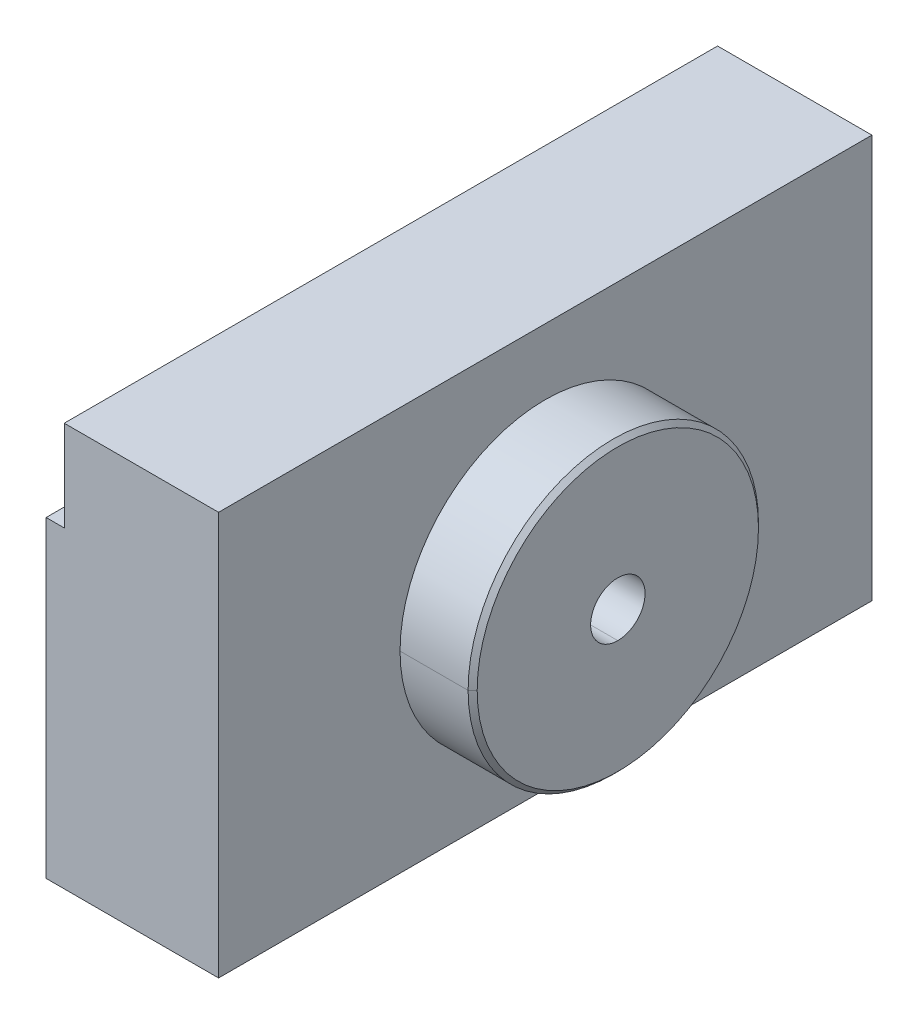
ISO-10303-21;
HEADER;
FILE_DESCRIPTION(('STEP AP214'),'2;1');
FILE_NAME('part.step','',(''),(''),'','','');
FILE_SCHEMA(('AUTOMOTIVE_DESIGN { 1 0 10303 214 1 1 1 1 }'));
ENDSEC;
DATA;
#1=APPLICATION_CONTEXT('core data for automotive mechanical design processes');
#2=APPLICATION_PROTOCOL_DEFINITION('international standard','automotive_design',2000,#1);
#3=PRODUCT_CONTEXT('',#1,'mechanical');
#4=PRODUCT('Part','Part','',(#3));
#5=PRODUCT_RELATED_PRODUCT_CATEGORY('part','',(#4));
#6=PRODUCT_DEFINITION_FORMATION('','',#4);
#7=PRODUCT_DEFINITION_CONTEXT('part definition',#1,'design');
#8=PRODUCT_DEFINITION('design','',#6,#7);
#9=PRODUCT_DEFINITION_SHAPE('','',#8);
#10=(LENGTH_UNIT() NAMED_UNIT(*) SI_UNIT(.MILLI.,.METRE.));
#11=(NAMED_UNIT(*) PLANE_ANGLE_UNIT() SI_UNIT($,.RADIAN.));
#12=(NAMED_UNIT(*) SI_UNIT($,.STERADIAN.) SOLID_ANGLE_UNIT());
#13=UNCERTAINTY_MEASURE_WITH_UNIT(LENGTH_MEASURE(1.E-05),#10,'distance_accuracy_value','');
#14=(GEOMETRIC_REPRESENTATION_CONTEXT(3) GLOBAL_UNCERTAINTY_ASSIGNED_CONTEXT((#13)) GLOBAL_UNIT_ASSIGNED_CONTEXT((#10,
#11,#12)) REPRESENTATION_CONTEXT('',''));
#15=CARTESIAN_POINT('',(0.,0.,0.));
#16=DIRECTION('',(0.,0.,1.));
#17=DIRECTION('',(1.,0.,0.));
#18=AXIS2_PLACEMENT_3D('',#15,#16,#17);
#19=CARTESIAN_POINT('',(12.7,33.655,-57.15));
#20=DIRECTION('',(-1.,0.,0.));
#21=DIRECTION('',(0.,0.,1.));
#22=AXIS2_PLACEMENT_3D('',#19,#20,#21);
#23=CONICAL_SURFACE('',#22,24.60625,0.785398163397463);
#24=DIRECTION('',(-0.707106781186537,0.,-0.707106781186559));
#25=VECTOR('',#24,1.);
#26=CARTESIAN_POINT('',(12.7,33.655,-81.75625));
#27=LINE('',#26,#25);
#28=CARTESIAN_POINT('',(12.7,33.655,-81.75625));
#29=VERTEX_POINT('',#28);
#30=CARTESIAN_POINT('',(11.90625,33.655,-82.55));
#31=VERTEX_POINT('',#30);
#32=EDGE_CURVE('E700',#29,#31,#27,.T.);
#33=ORIENTED_EDGE('',*,*,#32,.F.);
#34=CARTESIAN_POINT('',(12.7,33.655,-57.15));
#35=DIRECTION('',(1.,0.,0.));
#36=DIRECTION('',(0.,0.,-1.));
#37=AXIS2_PLACEMENT_3D('',#34,#35,#36);
#38=CIRCLE('',#37,24.60625);
#39=CARTESIAN_POINT('',(12.7,33.655,-32.54375));
#40=VERTEX_POINT('',#39);
#41=EDGE_CURVE('E27',#40,#29,#38,.T.);
#42=ORIENTED_EDGE('',*,*,#41,.F.);
#43=DIRECTION('',(-0.707106781186537,0.,0.707106781186559));
#44=VECTOR('',#43,1.);
#45=CARTESIAN_POINT('',(12.7,33.655,-32.54375));
#46=LINE('',#45,#44);
#47=CARTESIAN_POINT('',(11.90625,33.655,-31.75));
#48=VERTEX_POINT('',#47);
#49=EDGE_CURVE('E711',#40,#48,#46,.T.);
#50=ORIENTED_EDGE('',*,*,#49,.T.);
#51=CARTESIAN_POINT('',(11.90625,33.655,-57.15));
#52=DIRECTION('',(-1.,0.,0.));
#53=DIRECTION('',(0.,0.,-1.));
#54=AXIS2_PLACEMENT_3D('',#51,#52,#53);
#55=CIRCLE('',#54,25.4);
#56=EDGE_CURVE('E11',#31,#48,#55,.T.);
#57=ORIENTED_EDGE('',*,*,#56,.F.);
#58=EDGE_LOOP('',(#33,#42,#50,#57));
#59=FACE_BOUND('',#58,.T.);
#60=ADVANCED_FACE('F19',(#59),#23,.T.);
#61=CARTESIAN_POINT('',(12.7,33.655,-57.15));
#62=DIRECTION('',(-1.,0.,0.));
#63=DIRECTION('',(0.,0.,1.));
#64=AXIS2_PLACEMENT_3D('',#61,#62,#63);
#65=CYLINDRICAL_SURFACE('',#64,25.4);
#66=DIRECTION('',(-1.,0.,0.));
#67=VECTOR('',#66,1.);
#68=CARTESIAN_POINT('',(12.7,33.655,-82.55));
#69=LINE('',#68,#67);
#70=CARTESIAN_POINT('',(0.,33.655,-82.55));
#71=VERTEX_POINT('',#70);
#72=EDGE_CURVE('E725',#31,#71,#69,.T.);
#73=ORIENTED_EDGE('',*,*,#72,.F.);
#74=ORIENTED_EDGE('',*,*,#56,.T.);
#75=DIRECTION('',(-1.,0.,0.));
#76=VECTOR('',#75,1.);
#77=CARTESIAN_POINT('',(12.7,33.655,-31.75));
#78=LINE('',#77,#76);
#79=CARTESIAN_POINT('',(0.,33.655,-31.75));
#80=VERTEX_POINT('',#79);
#81=EDGE_CURVE('E169',#48,#80,#78,.T.);
#82=ORIENTED_EDGE('',*,*,#81,.T.);
#83=CARTESIAN_POINT('',(0.,33.655,-57.15));
#84=DIRECTION('',(1.,0.,0.));
#85=DIRECTION('',(0.,0.,-1.));
#86=AXIS2_PLACEMENT_3D('',#83,#84,#85);
#87=CIRCLE('',#86,25.4);
#88=EDGE_CURVE('E217',#80,#71,#87,.T.);
#89=ORIENTED_EDGE('',*,*,#88,.T.);
#90=EDGE_LOOP('',(#73,#74,#82,#89));
#91=FACE_BOUND('',#90,.T.);
#92=ADVANCED_FACE('F437',(#91),#65,.T.);
#93=CARTESIAN_POINT('',(12.7,33.655,-57.15));
#94=DIRECTION('',(1.,0.,0.));
#95=DIRECTION('',(0.,1.,0.));
#96=AXIS2_PLACEMENT_3D('',#93,#94,#95);
#97=PLANE('',#96);
#98=CARTESIAN_POINT('',(12.7,33.655,-57.15));
#99=DIRECTION('',(1.,0.,0.));
#100=DIRECTION('',(0.,0.,-1.));
#101=AXIS2_PLACEMENT_3D('',#98,#99,#100);
#102=CIRCLE('',#101,4.7625);
#103=CARTESIAN_POINT('',(12.7,28.8925,-57.15));
#104=VERTEX_POINT('',#103);
#105=CARTESIAN_POINT('',(12.7,38.4175,-57.15));
#106=VERTEX_POINT('',#105);
#107=EDGE_CURVE('E165',#104,#106,#102,.T.);
#108=ORIENTED_EDGE('',*,*,#107,.F.);
#109=CARTESIAN_POINT('',(12.7,33.655,-57.15));
#110=DIRECTION('',(1.,0.,0.));
#111=DIRECTION('',(0.,0.,-1.));
#112=AXIS2_PLACEMENT_3D('',#109,#110,#111);
#113=CIRCLE('',#112,4.7625);
#114=EDGE_CURVE('E225',#106,#104,#113,.T.);
#115=ORIENTED_EDGE('',*,*,#114,.F.);
#116=EDGE_LOOP('',(#108,#115));
#117=FACE_BOUND('',#116,.T.);
#118=ORIENTED_EDGE('',*,*,#41,.T.);
#119=CARTESIAN_POINT('',(12.7,33.655,-57.15));
#120=DIRECTION('',(1.,0.,0.));
#121=DIRECTION('',(0.,0.,-1.));
#122=AXIS2_PLACEMENT_3D('',#119,#120,#121);
#123=CIRCLE('',#122,24.60625);
#124=EDGE_CURVE('E708',#29,#40,#123,.T.);
#125=ORIENTED_EDGE('',*,*,#124,.T.);
#126=EDGE_LOOP('',(#118,#125));
#127=FACE_BOUND('',#126,.T.);
#128=ADVANCED_FACE('F427',(#117,#127),#97,.T.);
#129=CARTESIAN_POINT('',(-27.6352,33.655,-57.15));
#130=DIRECTION('',(-1.,0.,0.));
#131=DIRECTION('',(0.,-1.,0.));
#132=AXIS2_PLACEMENT_3D('',#129,#130,#131);
#133=CYLINDRICAL_SURFACE('',#132,12.7);
#134=DIRECTION('',(-1.,0.,0.));
#135=VECTOR('',#134,1.);
#136=CARTESIAN_POINT('',(-27.6352,46.355,-57.15));
#137=LINE('',#136,#135);
#138=CARTESIAN_POINT('',(-27.6352,46.355,-57.15));
#139=VERTEX_POINT('',#138);
#140=CARTESIAN_POINT('',(-30.1752,46.355,-57.15));
#141=VERTEX_POINT('',#140);
#142=EDGE_CURVE('E154',#139,#141,#137,.T.);
#143=ORIENTED_EDGE('',*,*,#142,.F.);
#144=CARTESIAN_POINT('',(-27.6352,33.655,-57.15));
#145=DIRECTION('',(-1.,0.,0.));
#146=DIRECTION('',(0.,-1.,0.));
#147=AXIS2_PLACEMENT_3D('',#144,#145,#146);
#148=CIRCLE('',#147,12.7);
#149=CARTESIAN_POINT('',(-27.6352,20.955,-57.15));
#150=VERTEX_POINT('',#149);
#151=EDGE_CURVE('E148',#150,#139,#148,.T.);
#152=ORIENTED_EDGE('',*,*,#151,.F.);
#153=DIRECTION('',(-1.,0.,0.));
#154=VECTOR('',#153,1.);
#155=CARTESIAN_POINT('',(-27.6352,20.955,-57.15));
#156=LINE('',#155,#154);
#157=CARTESIAN_POINT('',(-30.1752,20.955,-57.15));
#158=VERTEX_POINT('',#157);
#159=EDGE_CURVE('E151',#150,#158,#156,.T.);
#160=ORIENTED_EDGE('',*,*,#159,.T.);
#161=CARTESIAN_POINT('',(-30.1752,33.655,-57.15));
#162=DIRECTION('',(-1.,0.,0.));
#163=DIRECTION('',(0.,-1.,0.));
#164=AXIS2_PLACEMENT_3D('',#161,#162,#163);
#165=CIRCLE('',#164,12.7);
#166=EDGE_CURVE('E239',#158,#141,#165,.T.);
#167=ORIENTED_EDGE('',*,*,#166,.T.);
#168=EDGE_LOOP('',(#143,#152,#160,#167));
#169=FACE_BOUND('',#168,.T.);
#170=ADVANCED_FACE('F150',(#169),#133,.F.);
#171=CARTESIAN_POINT('',(-27.6352,33.655,-57.15));
#172=DIRECTION('',(-1.,0.,0.));
#173=DIRECTION('',(0.,1.,0.));
#174=AXIS2_PLACEMENT_3D('',#171,#172,#173);
#175=PLANE('',#174);
#176=CARTESIAN_POINT('',(-27.6352,33.655,-57.15));
#177=DIRECTION('',(1.,0.,0.));
#178=DIRECTION('',(0.,-1.,0.));
#179=AXIS2_PLACEMENT_3D('',#176,#177,#178);
#180=CIRCLE('',#179,4.7625);
#181=CARTESIAN_POINT('',(-27.6352,28.8925,-57.15));
#182=VERTEX_POINT('',#181);
#183=CARTESIAN_POINT('',(-27.6352,38.4175,-57.15));
#184=VERTEX_POINT('',#183);
#185=EDGE_CURVE('E188',#182,#184,#180,.T.);
#186=ORIENTED_EDGE('',*,*,#185,.T.);
#187=CARTESIAN_POINT('',(-27.6352,33.655,-57.15));
#188=DIRECTION('',(1.,0.,0.));
#189=DIRECTION('',(0.,-1.,0.));
#190=AXIS2_PLACEMENT_3D('',#187,#188,#189);
#191=CIRCLE('',#190,4.7625);
#192=EDGE_CURVE('E221',#184,#182,#191,.T.);
#193=ORIENTED_EDGE('',*,*,#192,.T.);
#194=EDGE_LOOP('',(#186,#193));
#195=FACE_BOUND('',#194,.T.);
#196=ORIENTED_EDGE('',*,*,#151,.T.);
#197=CARTESIAN_POINT('',(-27.6352,33.655,-57.15));
#198=DIRECTION('',(-1.,0.,0.));
#199=DIRECTION('',(0.,-1.,0.));
#200=AXIS2_PLACEMENT_3D('',#197,#198,#199);
#201=CIRCLE('',#200,12.7);
#202=EDGE_CURVE('E161',#139,#150,#201,.T.);
#203=ORIENTED_EDGE('',*,*,#202,.T.);
#204=EDGE_LOOP('',(#196,#203));
#205=FACE_BOUND('',#204,.T.);
#206=ADVANCED_FACE('F167',(#195,#205),#175,.T.);
#207=CARTESIAN_POINT('',(0.,0.,0.));
#208=DIRECTION('',(0.,0.,1.));
#209=DIRECTION('',(1.,0.,0.));
#210=AXIS2_PLACEMENT_3D('',#207,#208,#209);
#211=PLANE('',#210);
#212=DIRECTION('',(1.,0.,0.));
#213=VECTOR('',#212,1.);
#214=CARTESIAN_POINT('',(-30.1752,0.,0.));
#215=LINE('',#214,#213);
#216=CARTESIAN_POINT('',(-30.1752,0.,0.));
#217=VERTEX_POINT('',#216);
#218=CARTESIAN_POINT('',(0.,0.,0.));
#219=VERTEX_POINT('',#218);
#220=EDGE_CURVE('E224',#217,#219,#215,.T.);
#221=ORIENTED_EDGE('',*,*,#220,.T.);
#222=DIRECTION('',(0.,1.,0.));
#223=VECTOR('',#222,1.);
#224=CARTESIAN_POINT('',(0.,0.,0.));
#225=LINE('',#224,#223);
#226=CARTESIAN_POINT('',(0.,70.5612,0.));
#227=VERTEX_POINT('',#226);
#228=EDGE_CURVE('E203',#219,#227,#225,.T.);
#229=ORIENTED_EDGE('',*,*,#228,.T.);
#230=DIRECTION('',(-1.,0.,0.));
#231=VECTOR('',#230,1.);
#232=CARTESIAN_POINT('',(0.,70.5612,0.));
#233=LINE('',#232,#231);
#234=CARTESIAN_POINT('',(-27.0002,70.5612,0.));
#235=VERTEX_POINT('',#234);
#236=EDGE_CURVE('E51',#227,#235,#233,.T.);
#237=ORIENTED_EDGE('',*,*,#236,.T.);
#238=DIRECTION('',(0.,-1.,0.));
#239=VECTOR('',#238,1.);
#240=CARTESIAN_POINT('',(-27.0002,70.5612,0.));
#241=LINE('',#240,#239);
#242=CARTESIAN_POINT('',(-27.0002,54.6862,0.));
#243=VERTEX_POINT('',#242);
#244=EDGE_CURVE('E247',#235,#243,#241,.T.);
#245=ORIENTED_EDGE('',*,*,#244,.T.);
#246=DIRECTION('',(-1.,0.,0.));
#247=VECTOR('',#246,1.);
#248=CARTESIAN_POINT('',(-27.0002,54.6862,0.));
#249=LINE('',#248,#247);
#250=CARTESIAN_POINT('',(-30.1752,54.6862,0.));
#251=VERTEX_POINT('',#250);
#252=EDGE_CURVE('E242',#243,#251,#249,.T.);
#253=ORIENTED_EDGE('',*,*,#252,.T.);
#254=DIRECTION('',(0.,-1.,0.));
#255=VECTOR('',#254,1.);
#256=CARTESIAN_POINT('',(-30.1752,54.6862,0.));
#257=LINE('',#256,#255);
#258=EDGE_CURVE('E213',#251,#217,#257,.T.);
#259=ORIENTED_EDGE('',*,*,#258,.T.);
#260=EDGE_LOOP('',(#221,#229,#237,#245,#253,#259));
#261=FACE_BOUND('',#260,.T.);
#262=ADVANCED_FACE('F270',(#261),#211,.T.);
#263=CARTESIAN_POINT('',(0.,0.,-114.3));
#264=DIRECTION('',(0.,0.,1.));
#265=DIRECTION('',(1.,0.,0.));
#266=AXIS2_PLACEMENT_3D('',#263,#264,#265);
#267=PLANE('',#266);
#268=DIRECTION('',(1.,0.,0.));
#269=VECTOR('',#268,1.);
#270=CARTESIAN_POINT('',(-30.1752,0.,-114.3));
#271=LINE('',#270,#269);
#272=CARTESIAN_POINT('',(-30.1752,0.,-114.3));
#273=VERTEX_POINT('',#272);
#274=CARTESIAN_POINT('',(0.,0.,-114.3));
#275=VERTEX_POINT('',#274);
#276=EDGE_CURVE('E232',#273,#275,#271,.T.);
#277=ORIENTED_EDGE('',*,*,#276,.F.);
#278=DIRECTION('',(0.,-1.,0.));
#279=VECTOR('',#278,1.);
#280=CARTESIAN_POINT('',(-30.1752,54.6862,-114.3));
#281=LINE('',#280,#279);
#282=CARTESIAN_POINT('',(-30.1752,54.6862,-114.3));
#283=VERTEX_POINT('',#282);
#284=EDGE_CURVE('E212',#283,#273,#281,.T.);
#285=ORIENTED_EDGE('',*,*,#284,.F.);
#286=DIRECTION('',(-1.,0.,0.));
#287=VECTOR('',#286,1.);
#288=CARTESIAN_POINT('',(-27.0002,54.6862,-114.3));
#289=LINE('',#288,#287);
#290=CARTESIAN_POINT('',(-27.0002,54.6862,-114.3));
#291=VERTEX_POINT('',#290);
#292=EDGE_CURVE('E183',#291,#283,#289,.T.);
#293=ORIENTED_EDGE('',*,*,#292,.F.);
#294=DIRECTION('',(0.,-1.,0.));
#295=VECTOR('',#294,1.);
#296=CARTESIAN_POINT('',(-27.0002,70.5612,-114.3));
#297=LINE('',#296,#295);
#298=CARTESIAN_POINT('',(-27.0002,70.5612,-114.3));
#299=VERTEX_POINT('',#298);
#300=EDGE_CURVE('E220',#299,#291,#297,.T.);
#301=ORIENTED_EDGE('',*,*,#300,.F.);
#302=DIRECTION('',(-1.,0.,0.));
#303=VECTOR('',#302,1.);
#304=CARTESIAN_POINT('',(0.,70.5612,-114.3));
#305=LINE('',#304,#303);
#306=CARTESIAN_POINT('',(0.,70.5612,-114.3));
#307=VERTEX_POINT('',#306);
#308=EDGE_CURVE('E40',#307,#299,#305,.T.);
#309=ORIENTED_EDGE('',*,*,#308,.F.);
#310=DIRECTION('',(0.,1.,0.));
#311=VECTOR('',#310,1.);
#312=CARTESIAN_POINT('',(0.,0.,-114.3));
#313=LINE('',#312,#311);
#314=EDGE_CURVE('E202',#275,#307,#313,.T.);
#315=ORIENTED_EDGE('',*,*,#314,.F.);
#316=EDGE_LOOP('',(#277,#285,#293,#301,#309,#315));
#317=FACE_BOUND('',#316,.T.);
#318=ADVANCED_FACE('F275',(#317),#267,.F.);
#319=CARTESIAN_POINT('',(0.,70.5612,-114.3));
#320=DIRECTION('',(0.,1.,0.));
#321=DIRECTION('',(1.,0.,0.));
#322=AXIS2_PLACEMENT_3D('',#319,#320,#321);
#323=PLANE('',#322);
#324=ORIENTED_EDGE('',*,*,#236,.F.);
#325=DIRECTION('',(0.,0.,1.));
#326=VECTOR('',#325,1.);
#327=CARTESIAN_POINT('',(0.,70.5612,-114.3));
#328=LINE('',#327,#326);
#329=EDGE_CURVE('E207',#307,#227,#328,.T.);
#330=ORIENTED_EDGE('',*,*,#329,.F.);
#331=ORIENTED_EDGE('',*,*,#308,.T.);
#332=DIRECTION('',(0.,0.,1.));
#333=VECTOR('',#332,1.);
#334=CARTESIAN_POINT('',(-27.0002,70.5612,-114.3));
#335=LINE('',#334,#333);
#336=EDGE_CURVE('E250',#299,#235,#335,.T.);
#337=ORIENTED_EDGE('',*,*,#336,.T.);
#338=EDGE_LOOP('',(#324,#330,#331,#337));
#339=FACE_BOUND('',#338,.T.);
#340=ADVANCED_FACE('F286',(#339),#323,.T.);
#341=CARTESIAN_POINT('',(-27.0002,70.5612,-114.3));
#342=DIRECTION('',(-1.,0.,0.));
#343=DIRECTION('',(0.,1.,0.));
#344=AXIS2_PLACEMENT_3D('',#341,#342,#343);
#345=PLANE('',#344);
#346=ORIENTED_EDGE('',*,*,#244,.F.);
#347=ORIENTED_EDGE('',*,*,#336,.F.);
#348=ORIENTED_EDGE('',*,*,#300,.T.);
#349=DIRECTION('',(0.,0.,1.));
#350=VECTOR('',#349,1.);
#351=CARTESIAN_POINT('',(-27.0002,54.6862,-114.3));
#352=LINE('',#351,#350);
#353=EDGE_CURVE('E243',#291,#243,#352,.T.);
#354=ORIENTED_EDGE('',*,*,#353,.T.);
#355=EDGE_LOOP('',(#346,#347,#348,#354));
#356=FACE_BOUND('',#355,.T.);
#357=ADVANCED_FACE('F387',(#356),#345,.T.);
#358=CARTESIAN_POINT('',(-27.0002,54.6862,-114.3));
#359=DIRECTION('',(0.,1.,0.));
#360=DIRECTION('',(1.,0.,0.));
#361=AXIS2_PLACEMENT_3D('',#358,#359,#360);
#362=PLANE('',#361);
#363=ORIENTED_EDGE('',*,*,#252,.F.);
#364=ORIENTED_EDGE('',*,*,#353,.F.);
#365=ORIENTED_EDGE('',*,*,#292,.T.);
#366=DIRECTION('',(0.,0.,1.));
#367=VECTOR('',#366,1.);
#368=CARTESIAN_POINT('',(-30.1752,54.6862,-114.3));
#369=LINE('',#368,#367);
#370=EDGE_CURVE('E208',#283,#251,#369,.T.);
#371=ORIENTED_EDGE('',*,*,#370,.T.);
#372=EDGE_LOOP('',(#363,#364,#365,#371));
#373=FACE_BOUND('',#372,.T.);
#374=ADVANCED_FACE('F334',(#373),#362,.T.);
#375=CARTESIAN_POINT('',(-30.1752,54.6862,-114.3));
#376=DIRECTION('',(-1.,0.,0.));
#377=DIRECTION('',(0.,1.,0.));
#378=AXIS2_PLACEMENT_3D('',#375,#376,#377);
#379=PLANE('',#378);
#380=ORIENTED_EDGE('',*,*,#166,.F.);
#381=CARTESIAN_POINT('',(-30.1752,33.655,-57.15));
#382=DIRECTION('',(-1.,0.,0.));
#383=DIRECTION('',(0.,-1.,0.));
#384=AXIS2_PLACEMENT_3D('',#381,#382,#383);
#385=CIRCLE('',#384,12.7);
#386=EDGE_CURVE('E163',#141,#158,#385,.T.);
#387=ORIENTED_EDGE('',*,*,#386,.F.);
#388=EDGE_LOOP('',(#380,#387));
#389=FACE_BOUND('',#388,.T.);
#390=ORIENTED_EDGE('',*,*,#258,.F.);
#391=ORIENTED_EDGE('',*,*,#370,.F.);
#392=ORIENTED_EDGE('',*,*,#284,.T.);
#393=DIRECTION('',(0.,0.,1.));
#394=VECTOR('',#393,1.);
#395=CARTESIAN_POINT('',(-30.1752,0.,-114.3));
#396=LINE('',#395,#394);
#397=EDGE_CURVE('E228',#273,#217,#396,.T.);
#398=ORIENTED_EDGE('',*,*,#397,.T.);
#399=EDGE_LOOP('',(#390,#391,#392,#398));
#400=FACE_BOUND('',#399,.T.);
#401=ADVANCED_FACE('F329',(#389,#400),#379,.T.);
#402=CARTESIAN_POINT('',(-30.1752,0.,-114.3));
#403=DIRECTION('',(0.,-1.,0.));
#404=DIRECTION('',(0.,0.,-1.));
#405=AXIS2_PLACEMENT_3D('',#402,#403,#404);
#406=PLANE('',#405);
#407=ORIENTED_EDGE('',*,*,#220,.F.);
#408=ORIENTED_EDGE('',*,*,#397,.F.);
#409=ORIENTED_EDGE('',*,*,#276,.T.);
#410=DIRECTION('',(0.,0.,1.));
#411=VECTOR('',#410,1.);
#412=CARTESIAN_POINT('',(0.,0.,-114.3));
#413=LINE('',#412,#411);
#414=EDGE_CURVE('E198',#275,#219,#413,.T.);
#415=ORIENTED_EDGE('',*,*,#414,.T.);
#416=EDGE_LOOP('',(#407,#408,#409,#415));
#417=FACE_BOUND('',#416,.T.);
#418=ADVANCED_FACE('F333',(#417),#406,.T.);
#419=CARTESIAN_POINT('',(13.4703841816037,33.655,-57.15));
#420=DIRECTION('',(-1.,0.,0.));
#421=DIRECTION('',(0.,-1.,0.));
#422=AXIS2_PLACEMENT_3D('',#419,#420,#421);
#423=CYLINDRICAL_SURFACE('',#422,4.7625);
#424=DIRECTION('',(-1.,0.,0.));
#425=VECTOR('',#424,1.);
#426=CARTESIAN_POINT('',(13.4703841816037,38.4175,-57.15));
#427=LINE('',#426,#425);
#428=EDGE_CURVE('E185',#106,#184,#427,.T.);
#429=ORIENTED_EDGE('',*,*,#428,.F.);
#430=ORIENTED_EDGE('',*,*,#114,.T.);
#431=DIRECTION('',(-1.,0.,0.));
#432=VECTOR('',#431,1.);
#433=CARTESIAN_POINT('',(13.4703841816037,28.8925,-57.15));
#434=LINE('',#433,#432);
#435=EDGE_CURVE('E197',#104,#182,#434,.T.);
#436=ORIENTED_EDGE('',*,*,#435,.T.);
#437=ORIENTED_EDGE('',*,*,#192,.F.);
#438=EDGE_LOOP('',(#429,#430,#436,#437));
#439=FACE_BOUND('',#438,.T.);
#440=ADVANCED_FACE('F299',(#439),#423,.F.);
#441=CARTESIAN_POINT('',(0.,0.,-114.3));
#442=DIRECTION('',(1.,0.,0.));
#443=DIRECTION('',(0.,1.,0.));
#444=AXIS2_PLACEMENT_3D('',#441,#442,#443);
#445=PLANE('',#444);
#446=ORIENTED_EDGE('',*,*,#88,.F.);
#447=CARTESIAN_POINT('',(0.,33.655,-57.15));
#448=DIRECTION('',(1.,0.,0.));
#449=DIRECTION('',(0.,0.,-1.));
#450=AXIS2_PLACEMENT_3D('',#447,#448,#449);
#451=CIRCLE('',#450,25.4);
#452=EDGE_CURVE('E179',#71,#80,#451,.T.);
#453=ORIENTED_EDGE('',*,*,#452,.F.);
#454=EDGE_LOOP('',(#446,#453));
#455=FACE_BOUND('',#454,.T.);
#456=ORIENTED_EDGE('',*,*,#228,.F.);
#457=ORIENTED_EDGE('',*,*,#414,.F.);
#458=ORIENTED_EDGE('',*,*,#314,.T.);
#459=ORIENTED_EDGE('',*,*,#329,.T.);
#460=EDGE_LOOP('',(#456,#457,#458,#459));
#461=FACE_BOUND('',#460,.T.);
#462=ADVANCED_FACE('F294',(#455,#461),#445,.T.);
#463=CARTESIAN_POINT('',(13.4703841816037,33.655,-57.15));
#464=DIRECTION('',(-1.,0.,0.));
#465=DIRECTION('',(0.,-1.,0.));
#466=AXIS2_PLACEMENT_3D('',#463,#464,#465);
#467=CYLINDRICAL_SURFACE('',#466,4.7625);
#468=ORIENTED_EDGE('',*,*,#107,.T.);
#469=ORIENTED_EDGE('',*,*,#428,.T.);
#470=ORIENTED_EDGE('',*,*,#185,.F.);
#471=ORIENTED_EDGE('',*,*,#435,.F.);
#472=EDGE_LOOP('',(#468,#469,#470,#471));
#473=FACE_BOUND('',#472,.T.);
#474=ADVANCED_FACE('F298',(#473),#467,.F.);
#475=CARTESIAN_POINT('',(-27.6352,33.655,-57.15));
#476=DIRECTION('',(-1.,0.,0.));
#477=DIRECTION('',(0.,-1.,0.));
#478=AXIS2_PLACEMENT_3D('',#475,#476,#477);
#479=CYLINDRICAL_SURFACE('',#478,12.7);
#480=ORIENTED_EDGE('',*,*,#202,.F.);
#481=ORIENTED_EDGE('',*,*,#142,.T.);
#482=ORIENTED_EDGE('',*,*,#386,.T.);
#483=ORIENTED_EDGE('',*,*,#159,.F.);
#484=EDGE_LOOP('',(#480,#481,#482,#483));
#485=FACE_BOUND('',#484,.T.);
#486=ADVANCED_FACE('F160',(#485),#479,.F.);
#487=CARTESIAN_POINT('',(12.7,33.655,-57.15));
#488=DIRECTION('',(-1.,0.,0.));
#489=DIRECTION('',(0.,0.,1.));
#490=AXIS2_PLACEMENT_3D('',#487,#488,#489);
#491=CYLINDRICAL_SURFACE('',#490,25.4);
#492=CARTESIAN_POINT('',(11.90625,33.655,-57.15));
#493=DIRECTION('',(-1.,0.,0.));
#494=DIRECTION('',(0.,0.,-1.));
#495=AXIS2_PLACEMENT_3D('',#492,#493,#494);
#496=CIRCLE('',#495,25.4);
#497=EDGE_CURVE('E707',#48,#31,#496,.T.);
#498=ORIENTED_EDGE('',*,*,#497,.T.);
#499=ORIENTED_EDGE('',*,*,#72,.T.);
#500=ORIENTED_EDGE('',*,*,#452,.T.);
#501=ORIENTED_EDGE('',*,*,#81,.F.);
#502=EDGE_LOOP('',(#498,#499,#500,#501));
#503=FACE_BOUND('',#502,.T.);
#504=ADVANCED_FACE('F311',(#503),#491,.T.);
#505=CARTESIAN_POINT('',(12.7,33.655,-57.15));
#506=DIRECTION('',(-1.,0.,0.));
#507=DIRECTION('',(0.,0.,1.));
#508=AXIS2_PLACEMENT_3D('',#505,#506,#507);
#509=CONICAL_SURFACE('',#508,24.60625,0.785398163397463);
#510=ORIENTED_EDGE('',*,*,#124,.F.);
#511=ORIENTED_EDGE('',*,*,#32,.T.);
#512=ORIENTED_EDGE('',*,*,#497,.F.);
#513=ORIENTED_EDGE('',*,*,#49,.F.);
#514=EDGE_LOOP('',(#510,#511,#512,#513));
#515=FACE_BOUND('',#514,.T.);
#516=ADVANCED_FACE('F307',(#515),#509,.T.);
#517=CLOSED_SHELL('',(#60,#92,#128,#170,#206,#262,#318,#340,#357,#374,#401,#418,#440,#462,#474,
#486,#504,#516));
#518=MANIFOLD_SOLID_BREP('B1',#517);
#519=ADVANCED_BREP_SHAPE_REPRESENTATION('',(#18,#518),#14);
#520=SHAPE_DEFINITION_REPRESENTATION(#9,#519);
ENDSEC;
END-ISO-10303-21;
